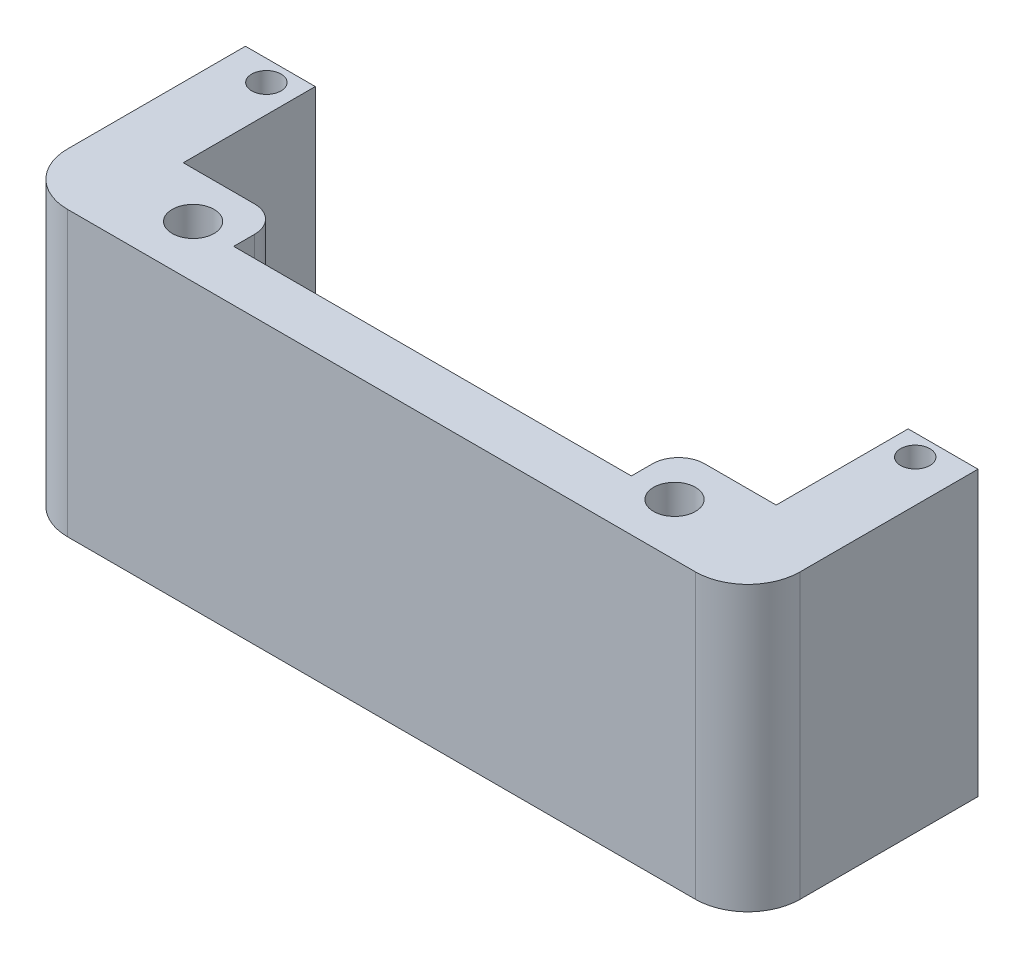
ISO-10303-21;
HEADER;
FILE_DESCRIPTION(('STEP AP214'),'2;1');
FILE_NAME('part.step','',(''),(''),'','','');
FILE_SCHEMA(('AUTOMOTIVE_DESIGN { 1 0 10303 214 1 1 1 1 }'));
ENDSEC;
DATA;
#1=APPLICATION_CONTEXT('core data for automotive mechanical design processes');
#2=APPLICATION_PROTOCOL_DEFINITION('international standard','automotive_design',2000,#1);
#3=PRODUCT_CONTEXT('',#1,'mechanical');
#4=PRODUCT('Part','Part','',(#3));
#5=PRODUCT_RELATED_PRODUCT_CATEGORY('part','',(#4));
#6=PRODUCT_DEFINITION_FORMATION('','',#4);
#7=PRODUCT_DEFINITION_CONTEXT('part definition',#1,'design');
#8=PRODUCT_DEFINITION('design','',#6,#7);
#9=PRODUCT_DEFINITION_SHAPE('','',#8);
#10=(LENGTH_UNIT() NAMED_UNIT(*) SI_UNIT(.MILLI.,.METRE.));
#11=(NAMED_UNIT(*) PLANE_ANGLE_UNIT() SI_UNIT($,.RADIAN.));
#12=(NAMED_UNIT(*) SI_UNIT($,.STERADIAN.) SOLID_ANGLE_UNIT());
#13=UNCERTAINTY_MEASURE_WITH_UNIT(LENGTH_MEASURE(1.E-05),#10,'distance_accuracy_value','');
#14=(GEOMETRIC_REPRESENTATION_CONTEXT(3) GLOBAL_UNCERTAINTY_ASSIGNED_CONTEXT((#13)) GLOBAL_UNIT_ASSIGNED_CONTEXT((#10,
#11,#12)) REPRESENTATION_CONTEXT('',''));
#15=CARTESIAN_POINT('',(0.,0.,0.));
#16=DIRECTION('',(0.,0.,1.));
#17=DIRECTION('',(1.,0.,0.));
#18=AXIS2_PLACEMENT_3D('',#15,#16,#17);
#19=CARTESIAN_POINT('',(-38.,54.2,0.));
#20=DIRECTION('',(-1.,0.,0.));
#21=DIRECTION('',(0.,0.,1.));
#22=AXIS2_PLACEMENT_3D('',#19,#20,#21);
#23=PLANE('',#22);
#24=DIRECTION('',(0.,0.,-1.));
#25=VECTOR('',#24,1.);
#26=CARTESIAN_POINT('',(-38.,0.,0.));
#27=LINE('',#26,#25);
#28=CARTESIAN_POINT('',(-38.,0.,6.30138942754601));
#29=VERTEX_POINT('',#28);
#30=CARTESIAN_POINT('',(-38.,0.,2.27743381269029));
#31=VERTEX_POINT('',#30);
#32=EDGE_CURVE('E487',#29,#31,#27,.T.);
#33=ORIENTED_EDGE('',*,*,#32,.T.);
#34=DIRECTION('',(0.,1.,0.));
#35=VECTOR('',#34,1.);
#36=CARTESIAN_POINT('',(-38.,54.2,2.27743381269029));
#37=LINE('',#36,#35);
#38=CARTESIAN_POINT('',(-38.,54.2,2.27743381269029));
#39=VERTEX_POINT('',#38);
#40=EDGE_CURVE('E94',#31,#39,#37,.T.);
#41=ORIENTED_EDGE('',*,*,#40,.T.);
#42=DIRECTION('',(0.,0.,-1.));
#43=VECTOR('',#42,1.);
#44=CARTESIAN_POINT('',(-38.,54.2,0.));
#45=LINE('',#44,#43);
#46=CARTESIAN_POINT('',(-38.,54.2,6.30138942754601));
#47=VERTEX_POINT('',#46);
#48=EDGE_CURVE('E557',#47,#39,#45,.T.);
#49=ORIENTED_EDGE('',*,*,#48,.F.);
#50=DIRECTION('',(0.,-1.,0.));
#51=VECTOR('',#50,1.);
#52=CARTESIAN_POINT('',(-38.,54.2,6.30138942754601));
#53=LINE('',#52,#51);
#54=EDGE_CURVE('E499',#47,#29,#53,.T.);
#55=ORIENTED_EDGE('',*,*,#54,.T.);
#56=EDGE_LOOP('',(#33,#41,#49,#55));
#57=FACE_BOUND('',#56,.T.);
#58=ADVANCED_FACE('F85',(#57),#23,.F.);
#59=CARTESIAN_POINT('',(0.,54.2,-27.948610572454));
#60=DIRECTION('',(0.,0.,1.));
#61=DIRECTION('',(1.,0.,0.));
#62=AXIS2_PLACEMENT_3D('',#59,#60,#61);
#63=PLANE('',#62);
#64=DIRECTION('',(0.,1.,0.));
#65=VECTOR('',#64,1.);
#66=CARTESIAN_POINT('',(-56.6546424897976,0.,-27.948610572454));
#67=LINE('',#66,#65);
#68=CARTESIAN_POINT('',(-56.6546424897976,0.,-27.948610572454));
#69=VERTEX_POINT('',#68);
#70=CARTESIAN_POINT('',(-56.6546424897976,54.2,-27.948610572454));
#71=VERTEX_POINT('',#70);
#72=EDGE_CURVE('E218',#69,#71,#67,.T.);
#73=ORIENTED_EDGE('',*,*,#72,.F.);
#74=DIRECTION('',(-1.,0.,0.));
#75=VECTOR('',#74,1.);
#76=CARTESIAN_POINT('',(0.,0.,-27.948610572454));
#77=LINE('',#76,#75);
#78=CARTESIAN_POINT('',(-70.,0.,-27.948610572454));
#79=VERTEX_POINT('',#78);
#80=EDGE_CURVE('E224',#69,#79,#77,.T.);
#81=ORIENTED_EDGE('',*,*,#80,.T.);
#82=DIRECTION('',(0.,-1.,0.));
#83=VECTOR('',#82,1.);
#84=CARTESIAN_POINT('',(-70.,54.2,-27.948610572454));
#85=LINE('',#84,#83);
#86=CARTESIAN_POINT('',(-70.,54.2,-27.948610572454));
#87=VERTEX_POINT('',#86);
#88=EDGE_CURVE('E495',#87,#79,#85,.T.);
#89=ORIENTED_EDGE('',*,*,#88,.F.);
#90=DIRECTION('',(-1.,0.,0.));
#91=VECTOR('',#90,1.);
#92=CARTESIAN_POINT('',(0.,54.2,-27.948610572454));
#93=LINE('',#92,#91);
#94=EDGE_CURVE('E561',#71,#87,#93,.T.);
#95=ORIENTED_EDGE('',*,*,#94,.F.);
#96=EDGE_LOOP('',(#73,#81,#89,#95));
#97=FACE_BOUND('',#96,.T.);
#98=ADVANCED_FACE('F370',(#97),#63,.F.);
#99=CARTESIAN_POINT('',(0.,54.2,0.));
#100=DIRECTION('',(0.,1.,0.));
#101=DIRECTION('',(0.,0.,1.));
#102=AXIS2_PLACEMENT_3D('',#99,#100,#101);
#103=PLANE('',#102);
#104=CARTESIAN_POINT('',(-62.,54.2,-23.9486105724532));
#105=DIRECTION('',(0.,1.,0.));
#106=DIRECTION('',(0.,0.,1.));
#107=AXIS2_PLACEMENT_3D('',#104,#105,#106);
#108=CIRCLE('',#107,2.79999999996412);
#109=CARTESIAN_POINT('',(-62.,54.2,-21.1486105724891));
#110=VERTEX_POINT('',#109);
#111=EDGE_CURVE('E418',#110,#110,#108,.T.);
#112=ORIENTED_EDGE('',*,*,#111,.F.);
#113=EDGE_LOOP('',(#112));
#114=FACE_BOUND('',#113,.T.);
#115=CARTESIAN_POINT('',(62.,54.2,-23.9486105724532));
#116=DIRECTION('',(0.,1.,0.));
#117=DIRECTION('',(0.,0.,1.));
#118=AXIS2_PLACEMENT_3D('',#115,#116,#117);
#119=CIRCLE('',#118,2.79999999940822);
#120=CARTESIAN_POINT('',(62.,54.2,-21.148610573045));
#121=VERTEX_POINT('',#120);
#122=EDGE_CURVE('E420',#121,#121,#119,.T.);
#123=ORIENTED_EDGE('',*,*,#122,.F.);
#124=EDGE_LOOP('',(#123));
#125=FACE_BOUND('',#124,.T.);
#126=CARTESIAN_POINT('',(45.9971929729477,54.2,10.0513884426212));
#127=CARTESIAN_POINT('',(53.9971910030972,54.2,10.0570024967261));
#128=CARTESIAN_POINT('',(54.002805057202,54.2,2.05700446657651));
#129=CARTESIAN_POINT('',(46.0028070270525,54.2,2.05139041247166));
#130=CARTESIAN_POINT('',(38.002808996903,54.2,2.0457763583668));
#131=CARTESIAN_POINT('',(37.9971949427981,54.2,10.0457743885163));
#132=CARTESIAN_POINT('',(45.9971929729477,54.2,10.0513884426212));
#133=(BOUNDED_CURVE() B_SPLINE_CURVE(3,(#126,#127,#128,#129,#130,#131,#132),.UNSPECIFIED.,.T.,
.F.) B_SPLINE_CURVE_WITH_KNOTS((4,3,4),(0.,0.5,1.),
.UNSPECIFIED.) CURVE() GEOMETRIC_REPRESENTATION_ITEM() RATIONAL_B_SPLINE_CURVE((1.,
0.333333333333333,0.333333333333333,1.,0.333333333333333,0.333333333333333,1.)) REPRESENTATION_ITEM(''));
#134=CARTESIAN_POINT('',(45.9971929729477,54.2,10.0513884426212));
#135=VERTEX_POINT('',#134);
#136=EDGE_CURVE('E262',#135,#135,#133,.T.);
#137=ORIENTED_EDGE('',*,*,#136,.F.);
#138=EDGE_LOOP('',(#137));
#139=FACE_BOUND('',#138,.T.);
#140=CARTESIAN_POINT('',(-49.9999990150746,54.2,6.04858240049451));
#141=CARTESIAN_POINT('',(-50.0056130691795,54.2,14.0485804306441));
#142=CARTESIAN_POINT('',(-42.00561503903,54.2,14.0541944847489));
#143=CARTESIAN_POINT('',(-42.0000009849251,54.2,6.05419645459937));
#144=CARTESIAN_POINT('',(-41.9943869308203,54.2,-1.94580157555017));
#145=CARTESIAN_POINT('',(-49.9943849609698,54.2,-1.95141562965503));
#146=CARTESIAN_POINT('',(-49.9999990150746,54.2,6.04858240049451));
#147=(BOUNDED_CURVE() B_SPLINE_CURVE(3,(#140,#141,#142,#143,#144,#145,#146),.UNSPECIFIED.,.T.,
.F.) B_SPLINE_CURVE_WITH_KNOTS((4,3,4),(0.,0.5,1.),
.UNSPECIFIED.) CURVE() GEOMETRIC_REPRESENTATION_ITEM() RATIONAL_B_SPLINE_CURVE((1.,
0.333333333333333,0.333333333333333,1.,0.333333333333333,0.333333333333333,1.)) REPRESENTATION_ITEM(''));
#148=CARTESIAN_POINT('',(-49.9999990150746,54.2,6.04858240049451));
#149=VERTEX_POINT('',#148);
#150=EDGE_CURVE('E278',#149,#149,#147,.T.);
#151=ORIENTED_EDGE('',*,*,#150,.F.);
#152=EDGE_LOOP('',(#151));
#153=FACE_BOUND('',#152,.T.);
#154=DIRECTION('',(1.,0.,0.));
#155=VECTOR('',#154,1.);
#156=CARTESIAN_POINT('',(0.,54.2,-2.72256618730971));
#157=LINE('',#156,#155);
#158=CARTESIAN_POINT('',(43.,54.2,-2.72256618730971));
#159=VERTEX_POINT('',#158);
#160=CARTESIAN_POINT('',(56.6546424897976,54.2,-2.72256618730971));
#161=VERTEX_POINT('',#160);
#162=EDGE_CURVE('E236',#159,#161,#157,.T.);
#163=ORIENTED_EDGE('',*,*,#162,.F.);
#164=CARTESIAN_POINT('',(43.,54.2,2.27743381269029));
#165=DIRECTION('',(0.,1.,0.));
#166=DIRECTION('',(0.,0.,1.));
#167=AXIS2_PLACEMENT_3D('',#164,#165,#166);
#168=CIRCLE('',#167,5.);
#169=CARTESIAN_POINT('',(38.,54.2,2.27743381269029));
#170=VERTEX_POINT('',#169);
#171=EDGE_CURVE('E448',#159,#170,#168,.T.);
#172=ORIENTED_EDGE('',*,*,#171,.T.);
#173=DIRECTION('',(0.,0.,-1.));
#174=VECTOR('',#173,1.);
#175=CARTESIAN_POINT('',(38.,54.2,0.));
#176=LINE('',#175,#174);
#177=CARTESIAN_POINT('',(38.,54.2,6.30138942754601));
#178=VERTEX_POINT('',#177);
#179=EDGE_CURVE('E310',#178,#170,#176,.T.);
#180=ORIENTED_EDGE('',*,*,#179,.F.);
#181=CARTESIAN_POINT('',(38.,54.2,6.30138942754601));
#182=CARTESIAN_POINT('',(37.4717467948348,54.2,6.31482039558676));
#183=CARTESIAN_POINT('',(36.9263937571559,54.2,6.30138942754601));
#184=B_SPLINE_CURVE_WITH_KNOTS('',2,(#181,#182,#183),.UNSPECIFIED.,.F.,.F.,(3,3),
(0.97238421970329,1.),.UNSPECIFIED.);
#185=CARTESIAN_POINT('',(36.9263937571559,54.2,6.30138942754601));
#186=VERTEX_POINT('',#185);
#187=EDGE_CURVE('E314',#178,#186,#184,.T.);
#188=ORIENTED_EDGE('',*,*,#187,.T.);
#189=DIRECTION('',(1.,0.,0.));
#190=VECTOR('',#189,1.);
#191=CARTESIAN_POINT('',(0.,54.2,6.30138942754601));
#192=LINE('',#191,#190);
#193=EDGE_CURVE('E320',#47,#186,#192,.T.);
#194=ORIENTED_EDGE('',*,*,#193,.F.);
#195=ORIENTED_EDGE('',*,*,#48,.T.);
#196=CARTESIAN_POINT('',(-43.,54.2,2.27743381269029));
#197=DIRECTION('',(0.,1.,0.));
#198=DIRECTION('',(0.,0.,1.));
#199=AXIS2_PLACEMENT_3D('',#196,#197,#198);
#200=CIRCLE('',#199,5.);
#201=CARTESIAN_POINT('',(-43.,54.2,-2.72256618730971));
#202=VERTEX_POINT('',#201);
#203=EDGE_CURVE('E539',#39,#202,#200,.T.);
#204=ORIENTED_EDGE('',*,*,#203,.T.);
#205=DIRECTION('',(-1.,0.,0.));
#206=VECTOR('',#205,1.);
#207=CARTESIAN_POINT('',(0.,54.2,-2.72256618730971));
#208=LINE('',#207,#206);
#209=CARTESIAN_POINT('',(-56.6546424897976,54.2,-2.72256618730971));
#210=VERTEX_POINT('',#209);
#211=EDGE_CURVE('E226',#202,#210,#208,.T.);
#212=ORIENTED_EDGE('',*,*,#211,.T.);
#213=DIRECTION('',(0.,0.,-1.));
#214=VECTOR('',#213,1.);
#215=CARTESIAN_POINT('',(-56.6546424897976,54.2,0.));
#216=LINE('',#215,#214);
#217=EDGE_CURVE('E216',#210,#71,#216,.T.);
#218=ORIENTED_EDGE('',*,*,#217,.T.);
#219=ORIENTED_EDGE('',*,*,#94,.T.);
#220=DIRECTION('',(0.,0.,1.));
#221=VECTOR('',#220,1.);
#222=CARTESIAN_POINT('',(-70.,54.2,0.));
#223=LINE('',#222,#221);
#224=CARTESIAN_POINT('',(-70.,54.2,6.051389427546));
#225=VERTEX_POINT('',#224);
#226=EDGE_CURVE('E500',#87,#225,#223,.T.);
#227=ORIENTED_EDGE('',*,*,#226,.T.);
#228=CARTESIAN_POINT('',(-60.,54.2,6.051389427546));
#229=DIRECTION('',(0.,1.,0.));
#230=DIRECTION('',(0.,0.,1.));
#231=AXIS2_PLACEMENT_3D('',#228,#229,#230);
#232=CIRCLE('',#231,10.);
#233=CARTESIAN_POINT('',(-60.,54.2,16.051389427546));
#234=VERTEX_POINT('',#233);
#235=EDGE_CURVE('E530',#225,#234,#232,.T.);
#236=ORIENTED_EDGE('',*,*,#235,.T.);
#237=DIRECTION('',(-1.,0.,0.));
#238=VECTOR('',#237,1.);
#239=CARTESIAN_POINT('',(0.,54.2,16.051389427546));
#240=LINE('',#239,#238);
#241=CARTESIAN_POINT('',(60.,54.2,16.051389427546));
#242=VERTEX_POINT('',#241);
#243=EDGE_CURVE('E295',#242,#234,#240,.T.);
#244=ORIENTED_EDGE('',*,*,#243,.F.);
#245=CARTESIAN_POINT('',(60.,54.2,6.051389427546));
#246=DIRECTION('',(0.,1.,0.));
#247=DIRECTION('',(0.,0.,1.));
#248=AXIS2_PLACEMENT_3D('',#245,#246,#247);
#249=CIRCLE('',#248,10.);
#250=CARTESIAN_POINT('',(70.,54.2,6.051389427546));
#251=VERTEX_POINT('',#250);
#252=EDGE_CURVE('E527',#242,#251,#249,.T.);
#253=ORIENTED_EDGE('',*,*,#252,.T.);
#254=DIRECTION('',(0.,0.,1.));
#255=VECTOR('',#254,1.);
#256=CARTESIAN_POINT('',(70.,54.2,0.));
#257=LINE('',#256,#255);
#258=CARTESIAN_POINT('',(70.,54.2,-27.948610572454));
#259=VERTEX_POINT('',#258);
#260=EDGE_CURVE('E302',#259,#251,#257,.T.);
#261=ORIENTED_EDGE('',*,*,#260,.F.);
#262=DIRECTION('',(1.,0.,0.));
#263=VECTOR('',#262,1.);
#264=CARTESIAN_POINT('',(0.,54.2,-27.948610572454));
#265=LINE('',#264,#263);
#266=CARTESIAN_POINT('',(56.6546424897976,54.2,-27.948610572454));
#267=VERTEX_POINT('',#266);
#268=EDGE_CURVE('E307',#267,#259,#265,.T.);
#269=ORIENTED_EDGE('',*,*,#268,.F.);
#270=DIRECTION('',(0.,0.,-1.));
#271=VECTOR('',#270,1.);
#272=CARTESIAN_POINT('',(56.6546424897976,54.2,0.));
#273=LINE('',#272,#271);
#274=EDGE_CURVE('E251',#161,#267,#273,.T.);
#275=ORIENTED_EDGE('',*,*,#274,.F.);
#276=EDGE_LOOP('',(#163,#172,#180,#188,#194,#195,#204,#212,#218,#219,#227,#236,#244,#253,#261,
#269,#275));
#277=FACE_BOUND('',#276,.T.);
#278=ADVANCED_FACE('F376',(#114,#125,#139,#153,#277),#103,.T.);
#279=CARTESIAN_POINT('',(0.,0.,0.));
#280=DIRECTION('',(0.,1.,0.));
#281=DIRECTION('',(0.,0.,1.));
#282=AXIS2_PLACEMENT_3D('',#279,#280,#281);
#283=PLANE('',#282);
#284=CARTESIAN_POINT('',(-62.,0.,-23.9486105724532));
#285=DIRECTION('',(0.,1.,0.));
#286=DIRECTION('',(0.,0.,1.));
#287=AXIS2_PLACEMENT_3D('',#284,#285,#286);
#288=CIRCLE('',#287,2.79999999996412);
#289=CARTESIAN_POINT('',(-62.,0.,-21.1486105724891));
#290=VERTEX_POINT('',#289);
#291=EDGE_CURVE('E250',#290,#290,#288,.T.);
#292=ORIENTED_EDGE('',*,*,#291,.T.);
#293=EDGE_LOOP('',(#292));
#294=FACE_BOUND('',#293,.T.);
#295=CARTESIAN_POINT('',(62.,0.,-23.9486105724532));
#296=DIRECTION('',(0.,1.,0.));
#297=DIRECTION('',(0.,0.,1.));
#298=AXIS2_PLACEMENT_3D('',#295,#296,#297);
#299=CIRCLE('',#298,2.79999999940822);
#300=CARTESIAN_POINT('',(62.,0.,-21.148610573045));
#301=VERTEX_POINT('',#300);
#302=EDGE_CURVE('E232',#301,#301,#299,.T.);
#303=ORIENTED_EDGE('',*,*,#302,.T.);
#304=EDGE_LOOP('',(#303));
#305=FACE_BOUND('',#304,.T.);
#306=CARTESIAN_POINT('',(-49.9999990150746,0.,6.04858240049451));
#307=CARTESIAN_POINT('',(-50.0056130691795,0.,14.0485804306441));
#308=CARTESIAN_POINT('',(-42.00561503903,0.,14.0541944847489));
#309=CARTESIAN_POINT('',(-42.0000009849251,0.,6.05419645459937));
#310=CARTESIAN_POINT('',(-41.9943869308203,0.,-1.94580157555017));
#311=CARTESIAN_POINT('',(-49.9943849609698,0.,-1.95141562965503));
#312=CARTESIAN_POINT('',(-49.9999990150746,0.,6.04858240049451));
#313=(BOUNDED_CURVE() B_SPLINE_CURVE(3,(#306,#307,#308,#309,#310,#311,#312),.UNSPECIFIED.,.T.,
.F.) B_SPLINE_CURVE_WITH_KNOTS((4,3,4),(0.,0.5,1.),
.UNSPECIFIED.) CURVE() GEOMETRIC_REPRESENTATION_ITEM() RATIONAL_B_SPLINE_CURVE((1.,
0.333333333333333,0.333333333333333,1.,0.333333333333333,0.333333333333333,1.)) REPRESENTATION_ITEM(''));
#314=CARTESIAN_POINT('',(-49.9999990150746,0.,6.04858240049451));
#315=VERTEX_POINT('',#314);
#316=EDGE_CURVE('E239',#315,#315,#313,.T.);
#317=ORIENTED_EDGE('',*,*,#316,.T.);
#318=EDGE_LOOP('',(#317));
#319=FACE_BOUND('',#318,.T.);
#320=CARTESIAN_POINT('',(45.9971929729477,0.,10.0513884426212));
#321=CARTESIAN_POINT('',(53.9971910030972,0.,10.0570024967261));
#322=CARTESIAN_POINT('',(54.002805057202,0.,2.05700446657651));
#323=CARTESIAN_POINT('',(46.0028070270525,0.,2.05139041247166));
#324=CARTESIAN_POINT('',(38.002808996903,0.,2.0457763583668));
#325=CARTESIAN_POINT('',(37.9971949427981,0.,10.0457743885163));
#326=CARTESIAN_POINT('',(45.9971929729477,0.,10.0513884426212));
#327=(BOUNDED_CURVE() B_SPLINE_CURVE(3,(#320,#321,#322,#323,#324,#325,#326),.UNSPECIFIED.,.T.,
.F.) B_SPLINE_CURVE_WITH_KNOTS((4,3,4),(0.,0.5,1.),
.UNSPECIFIED.) CURVE() GEOMETRIC_REPRESENTATION_ITEM() RATIONAL_B_SPLINE_CURVE((1.,
0.333333333333333,0.333333333333333,1.,0.333333333333333,0.333333333333333,1.)) REPRESENTATION_ITEM(''));
#328=CARTESIAN_POINT('',(45.9971929729477,0.,10.0513884426212));
#329=VERTEX_POINT('',#328);
#330=EDGE_CURVE('E269',#329,#329,#327,.T.);
#331=ORIENTED_EDGE('',*,*,#330,.T.);
#332=EDGE_LOOP('',(#331));
#333=FACE_BOUND('',#332,.T.);
#334=DIRECTION('',(0.,0.,-1.));
#335=VECTOR('',#334,1.);
#336=CARTESIAN_POINT('',(38.,0.,0.));
#337=LINE('',#336,#335);
#338=CARTESIAN_POINT('',(38.,0.,6.30138942754601));
#339=VERTEX_POINT('',#338);
#340=CARTESIAN_POINT('',(38.,0.,2.27743381269029));
#341=VERTEX_POINT('',#340);
#342=EDGE_CURVE('E464',#339,#341,#337,.T.);
#343=ORIENTED_EDGE('',*,*,#342,.T.);
#344=CARTESIAN_POINT('',(43.,0.,2.27743381269029));
#345=DIRECTION('',(0.,1.,0.));
#346=DIRECTION('',(0.,0.,1.));
#347=AXIS2_PLACEMENT_3D('',#344,#345,#346);
#348=CIRCLE('',#347,5.);
#349=CARTESIAN_POINT('',(43.,0.,-2.72256618730971));
#350=VERTEX_POINT('',#349);
#351=EDGE_CURVE('E549',#341,#350,#348,.F.);
#352=ORIENTED_EDGE('',*,*,#351,.T.);
#353=DIRECTION('',(1.,0.,0.));
#354=VECTOR('',#353,1.);
#355=CARTESIAN_POINT('',(0.,0.,-2.72256618730971));
#356=LINE('',#355,#354);
#357=CARTESIAN_POINT('',(56.6546424897976,0.,-2.72256618730971));
#358=VERTEX_POINT('',#357);
#359=EDGE_CURVE('E254',#350,#358,#356,.T.);
#360=ORIENTED_EDGE('',*,*,#359,.T.);
#361=DIRECTION('',(0.,0.,-1.));
#362=VECTOR('',#361,1.);
#363=CARTESIAN_POINT('',(56.6546424897976,0.,0.));
#364=LINE('',#363,#362);
#365=CARTESIAN_POINT('',(56.6546424897976,0.,-27.948610572454));
#366=VERTEX_POINT('',#365);
#367=EDGE_CURVE('E245',#358,#366,#364,.T.);
#368=ORIENTED_EDGE('',*,*,#367,.T.);
#369=DIRECTION('',(1.,0.,0.));
#370=VECTOR('',#369,1.);
#371=CARTESIAN_POINT('',(0.,0.,-27.948610572454));
#372=LINE('',#371,#370);
#373=CARTESIAN_POINT('',(70.,0.,-27.948610572454));
#374=VERTEX_POINT('',#373);
#375=EDGE_CURVE('E458',#366,#374,#372,.T.);
#376=ORIENTED_EDGE('',*,*,#375,.T.);
#377=DIRECTION('',(0.,0.,1.));
#378=VECTOR('',#377,1.);
#379=CARTESIAN_POINT('',(70.,0.,0.));
#380=LINE('',#379,#378);
#381=CARTESIAN_POINT('',(70.,0.,6.051389427546));
#382=VERTEX_POINT('',#381);
#383=EDGE_CURVE('E465',#374,#382,#380,.T.);
#384=ORIENTED_EDGE('',*,*,#383,.T.);
#385=CARTESIAN_POINT('',(60.,0.,6.051389427546));
#386=DIRECTION('',(0.,1.,0.));
#387=DIRECTION('',(0.,0.,1.));
#388=AXIS2_PLACEMENT_3D('',#385,#386,#387);
#389=CIRCLE('',#388,10.);
#390=CARTESIAN_POINT('',(60.,0.,16.051389427546));
#391=VERTEX_POINT('',#390);
#392=EDGE_CURVE('E518',#382,#391,#389,.F.);
#393=ORIENTED_EDGE('',*,*,#392,.T.);
#394=DIRECTION('',(-1.,0.,0.));
#395=VECTOR('',#394,1.);
#396=CARTESIAN_POINT('',(0.,0.,16.051389427546));
#397=LINE('',#396,#395);
#398=CARTESIAN_POINT('',(-60.,0.,16.051389427546));
#399=VERTEX_POINT('',#398);
#400=EDGE_CURVE('E268',#391,#399,#397,.T.);
#401=ORIENTED_EDGE('',*,*,#400,.T.);
#402=CARTESIAN_POINT('',(-60.,0.,6.051389427546));
#403=DIRECTION('',(0.,1.,0.));
#404=DIRECTION('',(0.,0.,1.));
#405=AXIS2_PLACEMENT_3D('',#402,#403,#404);
#406=CIRCLE('',#405,10.);
#407=CARTESIAN_POINT('',(-70.,0.,6.051389427546));
#408=VERTEX_POINT('',#407);
#409=EDGE_CURVE('E521',#399,#408,#406,.F.);
#410=ORIENTED_EDGE('',*,*,#409,.T.);
#411=DIRECTION('',(0.,0.,1.));
#412=VECTOR('',#411,1.);
#413=CARTESIAN_POINT('',(-70.,0.,0.));
#414=LINE('',#413,#412);
#415=EDGE_CURVE('E303',#79,#408,#414,.T.);
#416=ORIENTED_EDGE('',*,*,#415,.F.);
#417=ORIENTED_EDGE('',*,*,#80,.F.);
#418=DIRECTION('',(0.,0.,-1.));
#419=VECTOR('',#418,1.);
#420=CARTESIAN_POINT('',(-56.6546424897976,0.,0.));
#421=LINE('',#420,#419);
#422=CARTESIAN_POINT('',(-56.6546424897976,0.,-2.72256618730971));
#423=VERTEX_POINT('',#422);
#424=EDGE_CURVE('E210',#423,#69,#421,.T.);
#425=ORIENTED_EDGE('',*,*,#424,.F.);
#426=DIRECTION('',(-1.,0.,0.));
#427=VECTOR('',#426,1.);
#428=CARTESIAN_POINT('',(0.,0.,-2.72256618730971));
#429=LINE('',#428,#427);
#430=CARTESIAN_POINT('',(-43.,0.,-2.72256618730971));
#431=VERTEX_POINT('',#430);
#432=EDGE_CURVE('E203',#431,#423,#429,.T.);
#433=ORIENTED_EDGE('',*,*,#432,.F.);
#434=CARTESIAN_POINT('',(-43.,0.,2.27743381269029));
#435=DIRECTION('',(0.,1.,0.));
#436=DIRECTION('',(0.,0.,1.));
#437=AXIS2_PLACEMENT_3D('',#434,#435,#436);
#438=CIRCLE('',#437,5.);
#439=EDGE_CURVE('E101',#431,#31,#438,.F.);
#440=ORIENTED_EDGE('',*,*,#439,.T.);
#441=ORIENTED_EDGE('',*,*,#32,.F.);
#442=DIRECTION('',(1.,0.,0.));
#443=VECTOR('',#442,1.);
#444=CARTESIAN_POINT('',(0.,0.,6.30138942754601));
#445=LINE('',#444,#443);
#446=CARTESIAN_POINT('',(36.9263937571559,0.,6.30138942754601));
#447=VERTEX_POINT('',#446);
#448=EDGE_CURVE('E480',#29,#447,#445,.T.);
#449=ORIENTED_EDGE('',*,*,#448,.T.);
#450=CARTESIAN_POINT('',(38.,0.,6.30138942754601));
#451=CARTESIAN_POINT('',(37.4717467948348,0.,6.31482039558676));
#452=CARTESIAN_POINT('',(36.9263937571559,0.,6.30138942754601));
#453=B_SPLINE_CURVE_WITH_KNOTS('',2,(#450,#451,#452),.UNSPECIFIED.,.F.,.F.,(3,3),
(0.97238421970329,1.),.UNSPECIFIED.);
#454=EDGE_CURVE('E470',#339,#447,#453,.T.);
#455=ORIENTED_EDGE('',*,*,#454,.F.);
#456=EDGE_LOOP('',(#343,#352,#360,#368,#376,#384,#393,#401,#410,#416,#417,#425,#433,#440,#441,
#449,#455));
#457=FACE_BOUND('',#456,.T.);
#458=ADVANCED_FACE('F222',(#294,#305,#319,#333,#457),#283,.F.);
#459=CARTESIAN_POINT('',(0.,54.2,16.051389427546));
#460=DIRECTION('',(0.,0.,1.));
#461=DIRECTION('',(1.,0.,0.));
#462=AXIS2_PLACEMENT_3D('',#459,#460,#461);
#463=PLANE('',#462);
#464=ORIENTED_EDGE('',*,*,#243,.T.);
#465=DIRECTION('',(0.,-1.,0.));
#466=VECTOR('',#465,1.);
#467=CARTESIAN_POINT('',(-60.,0.,16.051389427546));
#468=LINE('',#467,#466);
#469=EDGE_CURVE('E514',#234,#399,#468,.T.);
#470=ORIENTED_EDGE('',*,*,#469,.T.);
#471=ORIENTED_EDGE('',*,*,#400,.F.);
#472=DIRECTION('',(0.,-1.,0.));
#473=VECTOR('',#472,1.);
#474=CARTESIAN_POINT('',(60.,54.2,16.051389427546));
#475=LINE('',#474,#473);
#476=EDGE_CURVE('E511',#391,#242,#475,.F.);
#477=ORIENTED_EDGE('',*,*,#476,.T.);
#478=EDGE_LOOP('',(#464,#470,#471,#477));
#479=FACE_BOUND('',#478,.T.);
#480=ADVANCED_FACE('F344',(#479),#463,.T.);
#481=CARTESIAN_POINT('',(70.,54.2,0.));
#482=DIRECTION('',(1.,0.,0.));
#483=DIRECTION('',(0.,0.,-1.));
#484=AXIS2_PLACEMENT_3D('',#481,#482,#483);
#485=PLANE('',#484);
#486=ORIENTED_EDGE('',*,*,#260,.T.);
#487=DIRECTION('',(0.,-1.,0.));
#488=VECTOR('',#487,1.);
#489=CARTESIAN_POINT('',(70.,54.2,6.051389427546));
#490=LINE('',#489,#488);
#491=EDGE_CURVE('E533',#251,#382,#490,.T.);
#492=ORIENTED_EDGE('',*,*,#491,.T.);
#493=ORIENTED_EDGE('',*,*,#383,.F.);
#494=DIRECTION('',(0.,-1.,0.));
#495=VECTOR('',#494,1.);
#496=CARTESIAN_POINT('',(70.,54.2,-27.948610572454));
#497=LINE('',#496,#495);
#498=EDGE_CURVE('E461',#259,#374,#497,.T.);
#499=ORIENTED_EDGE('',*,*,#498,.F.);
#500=EDGE_LOOP('',(#486,#492,#493,#499));
#501=FACE_BOUND('',#500,.T.);
#502=ADVANCED_FACE('F340',(#501),#485,.T.);
#503=CARTESIAN_POINT('',(0.,54.2,-27.948610572454));
#504=DIRECTION('',(0.,0.,-1.));
#505=DIRECTION('',(-1.,0.,0.));
#506=AXIS2_PLACEMENT_3D('',#503,#504,#505);
#507=PLANE('',#506);
#508=DIRECTION('',(0.,1.,0.));
#509=VECTOR('',#508,1.);
#510=CARTESIAN_POINT('',(56.6546424897976,0.,-27.948610572454));
#511=LINE('',#510,#509);
#512=EDGE_CURVE('E246',#366,#267,#511,.T.);
#513=ORIENTED_EDGE('',*,*,#512,.T.);
#514=ORIENTED_EDGE('',*,*,#268,.T.);
#515=ORIENTED_EDGE('',*,*,#498,.T.);
#516=ORIENTED_EDGE('',*,*,#375,.F.);
#517=EDGE_LOOP('',(#513,#514,#515,#516));
#518=FACE_BOUND('',#517,.T.);
#519=ADVANCED_FACE('F336',(#518),#507,.T.);
#520=CARTESIAN_POINT('',(38.,54.2,0.));
#521=DIRECTION('',(-1.,0.,0.));
#522=DIRECTION('',(0.,0.,1.));
#523=AXIS2_PLACEMENT_3D('',#520,#521,#522);
#524=PLANE('',#523);
#525=ORIENTED_EDGE('',*,*,#179,.T.);
#526=DIRECTION('',(0.,1.,0.));
#527=VECTOR('',#526,1.);
#528=CARTESIAN_POINT('',(38.,0.,2.27743381269029));
#529=LINE('',#528,#527);
#530=EDGE_CURVE('E544',#170,#341,#529,.F.);
#531=ORIENTED_EDGE('',*,*,#530,.T.);
#532=ORIENTED_EDGE('',*,*,#342,.F.);
#533=DIRECTION('',(0.,-1.,0.));
#534=VECTOR('',#533,1.);
#535=CARTESIAN_POINT('',(38.,54.2,6.30138942754601));
#536=LINE('',#535,#534);
#537=EDGE_CURVE('E506',#178,#339,#536,.T.);
#538=ORIENTED_EDGE('',*,*,#537,.F.);
#539=EDGE_LOOP('',(#525,#531,#532,#538));
#540=FACE_BOUND('',#539,.T.);
#541=ADVANCED_FACE('F331',(#540),#524,.T.);
#542=DIRECTION('',(0.,-1.,0.));
#543=VECTOR('',#542,1.);
#544=SURFACE_OF_LINEAR_EXTRUSION('',#184,#543);
#545=ORIENTED_EDGE('',*,*,#454,.T.);
#546=DIRECTION('',(0.,-1.,0.));
#547=VECTOR('',#546,1.);
#548=CARTESIAN_POINT('',(36.9263937571559,54.2,6.30138942754601));
#549=LINE('',#548,#547);
#550=EDGE_CURVE('E503',#186,#447,#549,.T.);
#551=ORIENTED_EDGE('',*,*,#550,.F.);
#552=ORIENTED_EDGE('',*,*,#187,.F.);
#553=ORIENTED_EDGE('',*,*,#537,.T.);
#554=EDGE_LOOP('',(#545,#551,#552,#553));
#555=FACE_BOUND('',#554,.T.);
#556=ADVANCED_FACE('F326',(#555),#544,.F.);
#557=CARTESIAN_POINT('',(0.,54.2,6.30138942754601));
#558=DIRECTION('',(0.,0.,-1.));
#559=DIRECTION('',(-1.,0.,0.));
#560=AXIS2_PLACEMENT_3D('',#557,#558,#559);
#561=PLANE('',#560);
#562=ORIENTED_EDGE('',*,*,#448,.F.);
#563=ORIENTED_EDGE('',*,*,#54,.F.);
#564=ORIENTED_EDGE('',*,*,#193,.T.);
#565=ORIENTED_EDGE('',*,*,#550,.T.);
#566=EDGE_LOOP('',(#562,#563,#564,#565));
#567=FACE_BOUND('',#566,.T.);
#568=ADVANCED_FACE('F330',(#567),#561,.T.);
#569=CARTESIAN_POINT('',(-70.,54.2,0.));
#570=DIRECTION('',(1.,0.,0.));
#571=DIRECTION('',(0.,0.,-1.));
#572=AXIS2_PLACEMENT_3D('',#569,#570,#571);
#573=PLANE('',#572);
#574=ORIENTED_EDGE('',*,*,#415,.T.);
#575=DIRECTION('',(0.,-1.,0.));
#576=VECTOR('',#575,1.);
#577=CARTESIAN_POINT('',(-70.,54.2,6.051389427546));
#578=LINE('',#577,#576);
#579=EDGE_CURVE('E524',#408,#225,#578,.F.);
#580=ORIENTED_EDGE('',*,*,#579,.T.);
#581=ORIENTED_EDGE('',*,*,#226,.F.);
#582=ORIENTED_EDGE('',*,*,#88,.T.);
#583=EDGE_LOOP('',(#574,#580,#581,#582));
#584=FACE_BOUND('',#583,.T.);
#585=ADVANCED_FACE('F353',(#584),#573,.F.);
#586=CARTESIAN_POINT('',(-60.,54.2,6.051389427546));
#587=DIRECTION('',(0.,1.,0.));
#588=DIRECTION('',(0.,0.,1.));
#589=AXIS2_PLACEMENT_3D('',#586,#587,#588);
#590=CYLINDRICAL_SURFACE('',#589,10.);
#591=ORIENTED_EDGE('',*,*,#235,.F.);
#592=ORIENTED_EDGE('',*,*,#579,.F.);
#593=ORIENTED_EDGE('',*,*,#409,.F.);
#594=ORIENTED_EDGE('',*,*,#469,.F.);
#595=EDGE_LOOP('',(#591,#592,#593,#594));
#596=FACE_BOUND('',#595,.T.);
#597=ADVANCED_FACE('F349',(#596),#590,.T.);
#598=CARTESIAN_POINT('',(60.,54.2,6.051389427546));
#599=DIRECTION('',(0.,-1.,0.));
#600=DIRECTION('',(0.,0.,-1.));
#601=AXIS2_PLACEMENT_3D('',#598,#599,#600);
#602=CYLINDRICAL_SURFACE('',#601,10.);
#603=ORIENTED_EDGE('',*,*,#252,.F.);
#604=ORIENTED_EDGE('',*,*,#476,.F.);
#605=ORIENTED_EDGE('',*,*,#392,.F.);
#606=ORIENTED_EDGE('',*,*,#491,.F.);
#607=EDGE_LOOP('',(#603,#604,#605,#606));
#608=FACE_BOUND('',#607,.T.);
#609=ADVANCED_FACE('F352',(#608),#602,.T.);
#610=CARTESIAN_POINT('',(-45.9999999999999,0.,6.05138942754694));
#611=DIRECTION('',(0.,1.,0.));
#612=DIRECTION('',(0.,0.,1.));
#613=AXIS2_PLACEMENT_3D('',#610,#611,#612);
#614=CYLINDRICAL_SURFACE('',#613,4.);
#615=ORIENTED_EDGE('',*,*,#316,.F.);
#616=EDGE_LOOP('',(#615));
#617=FACE_BOUND('',#616,.T.);
#618=ORIENTED_EDGE('',*,*,#150,.T.);
#619=EDGE_LOOP('',(#618));
#620=FACE_BOUND('',#619,.T.);
#621=ADVANCED_FACE('F356',(#617,#620),#614,.F.);
#622=CARTESIAN_POINT('',(46.0000000000001,0.,6.05138942754643));
#623=DIRECTION('',(0.,1.,0.));
#624=DIRECTION('',(0.,0.,1.));
#625=AXIS2_PLACEMENT_3D('',#622,#623,#624);
#626=CYLINDRICAL_SURFACE('',#625,4.);
#627=ORIENTED_EDGE('',*,*,#330,.F.);
#628=EDGE_LOOP('',(#627));
#629=FACE_BOUND('',#628,.T.);
#630=ORIENTED_EDGE('',*,*,#136,.T.);
#631=EDGE_LOOP('',(#630));
#632=FACE_BOUND('',#631,.T.);
#633=ADVANCED_FACE('F391',(#629,#632),#626,.F.);
#634=CARTESIAN_POINT('',(0.,0.,-2.72256618730971));
#635=DIRECTION('',(0.,0.,1.));
#636=DIRECTION('',(1.,0.,0.));
#637=AXIS2_PLACEMENT_3D('',#634,#635,#636);
#638=PLANE('',#637);
#639=ORIENTED_EDGE('',*,*,#359,.F.);
#640=DIRECTION('',(0.,1.,0.));
#641=VECTOR('',#640,1.);
#642=CARTESIAN_POINT('',(43.,54.2,-2.72256618730971));
#643=LINE('',#642,#641);
#644=EDGE_CURVE('E455',#350,#159,#643,.T.);
#645=ORIENTED_EDGE('',*,*,#644,.T.);
#646=ORIENTED_EDGE('',*,*,#162,.T.);
#647=DIRECTION('',(0.,1.,0.));
#648=VECTOR('',#647,1.);
#649=CARTESIAN_POINT('',(56.6546424897976,0.,-2.72256618730971));
#650=LINE('',#649,#648);
#651=EDGE_CURVE('E241',#358,#161,#650,.T.);
#652=ORIENTED_EDGE('',*,*,#651,.F.);
#653=EDGE_LOOP('',(#639,#645,#646,#652));
#654=FACE_BOUND('',#653,.T.);
#655=ADVANCED_FACE('F395',(#654),#638,.F.);
#656=CARTESIAN_POINT('',(56.6546424897976,0.,0.));
#657=DIRECTION('',(1.,0.,0.));
#658=DIRECTION('',(0.,0.,-1.));
#659=AXIS2_PLACEMENT_3D('',#656,#657,#658);
#660=PLANE('',#659);
#661=ORIENTED_EDGE('',*,*,#274,.T.);
#662=ORIENTED_EDGE('',*,*,#512,.F.);
#663=ORIENTED_EDGE('',*,*,#367,.F.);
#664=ORIENTED_EDGE('',*,*,#651,.T.);
#665=EDGE_LOOP('',(#661,#662,#663,#664));
#666=FACE_BOUND('',#665,.T.);
#667=ADVANCED_FACE('F397',(#666),#660,.F.);
#668=CARTESIAN_POINT('',(-56.6546424897976,0.,0.));
#669=DIRECTION('',(1.,0.,0.));
#670=DIRECTION('',(0.,0.,-1.));
#671=AXIS2_PLACEMENT_3D('',#668,#669,#670);
#672=PLANE('',#671);
#673=ORIENTED_EDGE('',*,*,#217,.F.);
#674=DIRECTION('',(0.,1.,0.));
#675=VECTOR('',#674,1.);
#676=CARTESIAN_POINT('',(-56.6546424897976,0.,-2.72256618730971));
#677=LINE('',#676,#675);
#678=EDGE_CURVE('E206',#423,#210,#677,.T.);
#679=ORIENTED_EDGE('',*,*,#678,.F.);
#680=ORIENTED_EDGE('',*,*,#424,.T.);
#681=ORIENTED_EDGE('',*,*,#72,.T.);
#682=EDGE_LOOP('',(#673,#679,#680,#681));
#683=FACE_BOUND('',#682,.T.);
#684=ADVANCED_FACE('F213',(#683),#672,.T.);
#685=CARTESIAN_POINT('',(0.,0.,-2.72256618730971));
#686=DIRECTION('',(0.,0.,-1.));
#687=DIRECTION('',(-1.,0.,0.));
#688=AXIS2_PLACEMENT_3D('',#685,#686,#687);
#689=PLANE('',#688);
#690=ORIENTED_EDGE('',*,*,#211,.F.);
#691=DIRECTION('',(0.,1.,0.));
#692=VECTOR('',#691,1.);
#693=CARTESIAN_POINT('',(-43.,0.,-2.72256618730971));
#694=LINE('',#693,#692);
#695=EDGE_CURVE('E14',#202,#431,#694,.F.);
#696=ORIENTED_EDGE('',*,*,#695,.T.);
#697=ORIENTED_EDGE('',*,*,#432,.T.);
#698=ORIENTED_EDGE('',*,*,#678,.T.);
#699=EDGE_LOOP('',(#690,#696,#697,#698));
#700=FACE_BOUND('',#699,.T.);
#701=ADVANCED_FACE('F205',(#700),#689,.T.);
#702=CARTESIAN_POINT('',(43.,0.,2.27743381269029));
#703=DIRECTION('',(0.,-1.,0.));
#704=DIRECTION('',(0.,0.,-1.));
#705=AXIS2_PLACEMENT_3D('',#702,#703,#704);
#706=CYLINDRICAL_SURFACE('',#705,5.);
#707=ORIENTED_EDGE('',*,*,#351,.F.);
#708=ORIENTED_EDGE('',*,*,#530,.F.);
#709=ORIENTED_EDGE('',*,*,#171,.F.);
#710=ORIENTED_EDGE('',*,*,#644,.F.);
#711=EDGE_LOOP('',(#707,#708,#709,#710));
#712=FACE_BOUND('',#711,.T.);
#713=ADVANCED_FACE('F358',(#712),#706,.T.);
#714=CARTESIAN_POINT('',(-43.,54.2,2.27743381269029));
#715=DIRECTION('',(0.,-1.,0.));
#716=DIRECTION('',(0.,0.,-1.));
#717=AXIS2_PLACEMENT_3D('',#714,#715,#716);
#718=CYLINDRICAL_SURFACE('',#717,5.);
#719=ORIENTED_EDGE('',*,*,#439,.F.);
#720=ORIENTED_EDGE('',*,*,#695,.F.);
#721=ORIENTED_EDGE('',*,*,#203,.F.);
#722=ORIENTED_EDGE('',*,*,#40,.F.);
#723=EDGE_LOOP('',(#719,#720,#721,#722));
#724=FACE_BOUND('',#723,.T.);
#725=ADVANCED_FACE('F87',(#724),#718,.T.);
#726=CARTESIAN_POINT('',(62.,0.,-23.9486105724532));
#727=DIRECTION('',(0.,1.,0.));
#728=DIRECTION('',(0.,0.,1.));
#729=AXIS2_PLACEMENT_3D('',#726,#727,#728);
#730=CYLINDRICAL_SURFACE('',#729,2.79999999940822);
#731=ORIENTED_EDGE('',*,*,#302,.F.);
#732=EDGE_LOOP('',(#731));
#733=FACE_BOUND('',#732,.T.);
#734=ORIENTED_EDGE('',*,*,#122,.T.);
#735=EDGE_LOOP('',(#734));
#736=FACE_BOUND('',#735,.T.);
#737=ADVANCED_FACE('F365',(#733,#736),#730,.F.);
#738=CARTESIAN_POINT('',(-62.,0.,-23.9486105724532));
#739=DIRECTION('',(0.,1.,0.));
#740=DIRECTION('',(0.,0.,1.));
#741=AXIS2_PLACEMENT_3D('',#738,#739,#740);
#742=CYLINDRICAL_SURFACE('',#741,2.79999999996412);
#743=ORIENTED_EDGE('',*,*,#291,.F.);
#744=EDGE_LOOP('',(#743));
#745=FACE_BOUND('',#744,.T.);
#746=ORIENTED_EDGE('',*,*,#111,.T.);
#747=EDGE_LOOP('',(#746));
#748=FACE_BOUND('',#747,.T.);
#749=ADVANCED_FACE('F407',(#745,#748),#742,.F.);
#750=CLOSED_SHELL('',(#58,#98,#278,#458,#480,#502,#519,#541,#556,#568,#585,#597,#609,#621,#633,
#655,#667,#684,#701,#713,#725,#737,#749));
#751=MANIFOLD_SOLID_BREP('B2',#750);
#752=ADVANCED_BREP_SHAPE_REPRESENTATION('',(#18,#751),#14);
#753=SHAPE_DEFINITION_REPRESENTATION(#9,#752);
ENDSEC;
END-ISO-10303-21;
